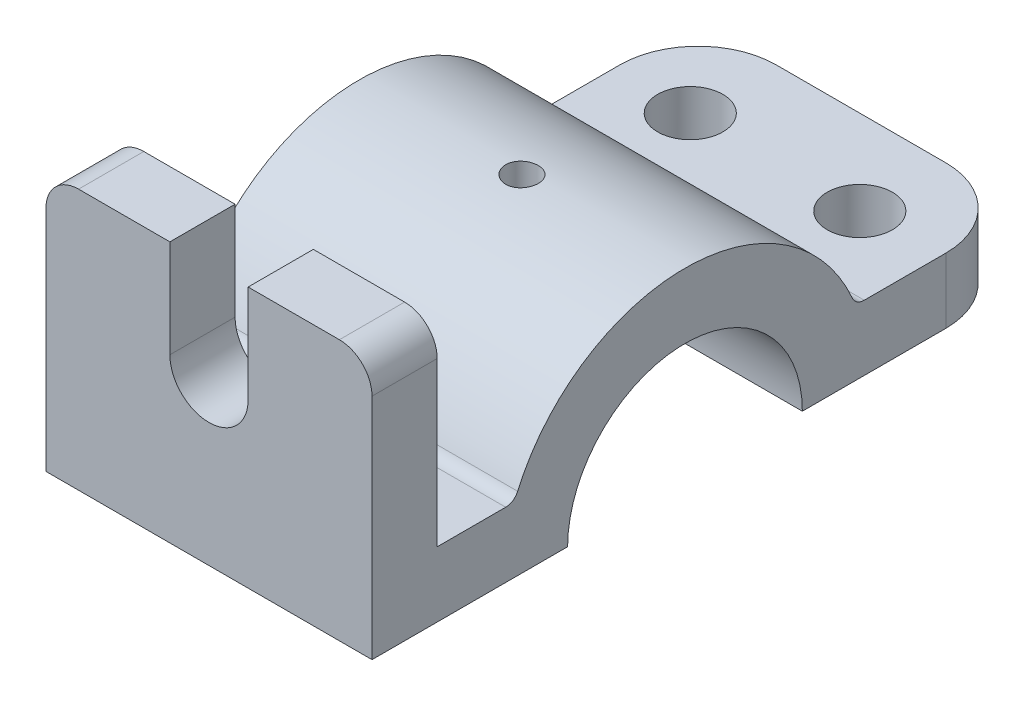
ISO-10303-21;
HEADER;
FILE_DESCRIPTION(('STEP AP214'),'2;1');
FILE_NAME('part.step','',(''),(''),'','','');
FILE_SCHEMA(('AUTOMOTIVE_DESIGN { 1 0 10303 214 1 1 1 1 }'));
ENDSEC;
DATA;
#1=APPLICATION_CONTEXT('core data for automotive mechanical design processes');
#2=APPLICATION_PROTOCOL_DEFINITION('international standard','automotive_design',2000,#1);
#3=PRODUCT_CONTEXT('',#1,'mechanical');
#4=PRODUCT('Part','Part','',(#3));
#5=PRODUCT_RELATED_PRODUCT_CATEGORY('part','',(#4));
#6=PRODUCT_DEFINITION_FORMATION('','',#4);
#7=PRODUCT_DEFINITION_CONTEXT('part definition',#1,'design');
#8=PRODUCT_DEFINITION('design','',#6,#7);
#9=PRODUCT_DEFINITION_SHAPE('','',#8);
#10=(LENGTH_UNIT() NAMED_UNIT(*) SI_UNIT(.MILLI.,.METRE.));
#11=(NAMED_UNIT(*) PLANE_ANGLE_UNIT() SI_UNIT($,.RADIAN.));
#12=(NAMED_UNIT(*) SI_UNIT($,.STERADIAN.) SOLID_ANGLE_UNIT());
#13=UNCERTAINTY_MEASURE_WITH_UNIT(LENGTH_MEASURE(1.E-05),#10,'distance_accuracy_value','');
#14=(GEOMETRIC_REPRESENTATION_CONTEXT(3) GLOBAL_UNCERTAINTY_ASSIGNED_CONTEXT((#13)) GLOBAL_UNIT_ASSIGNED_CONTEXT((#10,
#11,#12)) REPRESENTATION_CONTEXT('',''));
#15=CARTESIAN_POINT('',(0.,0.,0.));
#16=DIRECTION('',(0.,0.,1.));
#17=DIRECTION('',(1.,0.,0.));
#18=AXIS2_PLACEMENT_3D('',#15,#16,#17);
#19=CARTESIAN_POINT('',(-50.,40.,48.));
#20=DIRECTION('',(0.,1.,0.));
#21=DIRECTION('',(0.,0.,1.));
#22=AXIS2_PLACEMENT_3D('',#19,#20,#21);
#23=PLANE('',#22);
#24=DIRECTION('',(0.,0.,1.));
#25=VECTOR('',#24,1.);
#26=CARTESIAN_POINT('',(-31.,40.,13.8132267551043));
#27=LINE('',#26,#25);
#28=CARTESIAN_POINT('',(-31.,40.,38.));
#29=VERTEX_POINT('',#28);
#30=CARTESIAN_POINT('',(-31.,40.,48.));
#31=VERTEX_POINT('',#30);
#32=EDGE_CURVE('E222',#29,#31,#27,.T.);
#33=ORIENTED_EDGE('',*,*,#32,.F.);
#34=DIRECTION('',(1.,0.,0.));
#35=VECTOR('',#34,1.);
#36=CARTESIAN_POINT('',(-50.,40.,38.));
#37=LINE('',#36,#35);
#38=CARTESIAN_POINT('',(-45.,40.,38.));
#39=VERTEX_POINT('',#38);
#40=EDGE_CURVE('E205',#39,#29,#37,.T.);
#41=ORIENTED_EDGE('',*,*,#40,.F.);
#42=DIRECTION('',(0.,0.,1.));
#43=VECTOR('',#42,1.);
#44=CARTESIAN_POINT('',(-45.,40.,48.));
#45=LINE('',#44,#43);
#46=CARTESIAN_POINT('',(-45.,40.,48.));
#47=VERTEX_POINT('',#46);
#48=EDGE_CURVE('E321',#39,#47,#45,.T.);
#49=ORIENTED_EDGE('',*,*,#48,.T.);
#50=DIRECTION('',(1.,0.,0.));
#51=VECTOR('',#50,1.);
#52=CARTESIAN_POINT('',(-50.,40.,48.));
#53=LINE('',#52,#51);
#54=EDGE_CURVE('E295',#47,#31,#53,.T.);
#55=ORIENTED_EDGE('',*,*,#54,.T.);
#56=EDGE_LOOP('',(#33,#41,#49,#55));
#57=FACE_BOUND('',#56,.T.);
#58=ADVANCED_FACE('F45',(#57),#23,.T.);
#59=CARTESIAN_POINT('',(-50.,0.,0.));
#60=DIRECTION('',(1.,0.,0.));
#61=DIRECTION('',(0.,0.,-1.));
#62=AXIS2_PLACEMENT_3D('',#59,#60,#61);
#63=CYLINDRICAL_SURFACE('',#62,18.);
#64=CARTESIAN_POINT('',(-25.,17.8255434699759,2.5));
#65=CARTESIAN_POINT('',(-24.8603024398441,17.8255456651778,2.49999414647207));
#66=CARTESIAN_POINT('',(-24.720520879389,17.8272034218136,2.48825119822493));
#67=CARTESIAN_POINT('',(-24.4448574895751,17.8336517721437,2.44159735847892));
#68=CARTESIAN_POINT('',(-24.3089797346522,17.8384455231609,2.4066631174329));
#69=CARTESIAN_POINT('',(-24.0451544790156,17.850612662598,2.31468476561208));
#70=CARTESIAN_POINT('',(-23.917201299054,17.8579841778482,2.25765670639229));
#71=CARTESIAN_POINT('',(-23.6727013407084,17.8744740260859,2.12314581292503));
#72=CARTESIAN_POINT('',(-23.5561528193297,17.883592091513,2.04566611105294));
#73=CARTESIAN_POINT('',(-23.3369479132659,17.9026178552788,1.87188129283679));
#74=CARTESIAN_POINT('',(-23.2343813714768,17.9125300649078,1.77546333288681));
#75=CARTESIAN_POINT('',(-23.0468293366808,17.9319868631884,1.56678234973466));
#76=CARTESIAN_POINT('',(-22.9618447665517,17.941531432521,1.45451849530127));
#77=CARTESIAN_POINT('',(-22.8115415716044,17.9592243086621,1.21676158545023));
#78=CARTESIAN_POINT('',(-22.7463050644584,17.9673667260989,1.09121614197955));
#79=CARTESIAN_POINT('',(-22.6378763141992,17.9812880686337,0.830818835610925));
#80=CARTESIAN_POINT('',(-22.5946830686033,17.9870671012112,0.695967396247416));
#81=CARTESIAN_POINT('',(-22.5318375950693,17.9955787286343,0.421708758837697));
#82=CARTESIAN_POINT('',(-22.5120353483376,17.9983307295005,0.282336549066869));
#83=CARTESIAN_POINT('',(-22.4960685804611,18.0005446194064,0.00222208197153337));
#84=CARTESIAN_POINT('',(-22.4999029241978,18.0000066664419,-0.138520109237201));
#85=CARTESIAN_POINT('',(-22.5309812504974,17.9957168570418,-0.416357194248957));
#86=CARTESIAN_POINT('',(-22.5580638636251,17.9919871555225,-0.553470528957734));
#87=CARTESIAN_POINT('',(-22.6346171415796,17.9817576581678,-0.821187276586971));
#88=CARTESIAN_POINT('',(-22.6840883141918,17.9752577995039,-0.951790541780741));
#89=CARTESIAN_POINT('',(-22.8041825811449,17.9601801355727,-1.20327342479254));
#90=CARTESIAN_POINT('',(-22.8748744928555,17.9515955873736,-1.32411975854592));
#91=CARTESIAN_POINT('',(-23.0353534008281,17.933307030451,-1.55229539206434));
#92=CARTESIAN_POINT('',(-23.1251414767556,17.9236029584457,-1.6596239270089));
#93=CARTESIAN_POINT('',(-23.3221652052143,17.9040627416807,-1.85866707142927));
#94=CARTESIAN_POINT('',(-23.4295416350916,17.8942261733153,-1.95024234614373));
#95=CARTESIAN_POINT('',(-23.658213295894,17.8756098810753,-2.11409384295317));
#96=CARTESIAN_POINT('',(-23.7795085910069,17.8668301620749,-2.18636997604351));
#97=CARTESIAN_POINT('',(-24.0327102271101,17.8513218970602,-2.30958526232834));
#98=CARTESIAN_POINT('',(-24.1646228984433,17.8445945863646,-2.36051157220434));
#99=CARTESIAN_POINT('',(-24.4352426550245,17.8339756835222,-2.43944921221491));
#100=CARTESIAN_POINT('',(-24.573949332164,17.8300839212696,-2.46746191695965));
#101=CARTESIAN_POINT('',(-24.8529842890421,17.8256085226883,-2.49958914868686));
#102=CARTESIAN_POINT('',(-24.9932894831189,17.8249976384891,-2.50390052359804));
#103=CARTESIAN_POINT('',(-25.2726202693447,17.8270809550551,-2.48902367005747));
#104=CARTESIAN_POINT('',(-25.4116458952648,17.8297750683396,-2.46983606360645));
#105=CARTESIAN_POINT('',(-25.6838706006518,17.8381398718555,-2.40867230893183));
#106=CARTESIAN_POINT('',(-25.8170918480129,17.8437979170435,-2.3667929448424));
#107=CARTESIAN_POINT('',(-26.0746226062418,17.8574427280592,-2.26153466064822));
#108=CARTESIAN_POINT('',(-26.1989317351835,17.8654295936137,-2.19815481981357));
#109=CARTESIAN_POINT('',(-26.4359958172227,17.8828968337135,-2.05121661698077));
#110=CARTESIAN_POINT('',(-26.5486706068941,17.8923865584876,-1.96753005280694));
#111=CARTESIAN_POINT('',(-26.7584463845479,17.9117615643821,-1.7825335739982));
#112=CARTESIAN_POINT('',(-26.8555466205301,17.9216468645736,-1.68122280889013));
#113=CARTESIAN_POINT('',(-27.0321167080711,17.9407836925958,-1.46299009780057));
#114=CARTESIAN_POINT('',(-27.1114566166581,17.95003022752,-1.34596251463768));
#115=CARTESIAN_POINT('',(-27.2493514621579,17.9667715107689,-1.10012679276879));
#116=CARTESIAN_POINT('',(-27.3079068998178,17.9742663012958,-0.971318937971421));
#117=CARTESIAN_POINT('',(-27.402359747304,17.9866376355466,-0.705996872679641));
#118=CARTESIAN_POINT('',(-27.4383300854722,17.9915225988255,-0.56950903318716));
#119=CARTESIAN_POINT('',(-27.4868282942683,17.9981590483869,-0.292358088096121));
#120=CARTESIAN_POINT('',(-27.4993574832228,17.9999107108855,-0.15169521775266));
#121=CARTESIAN_POINT('',(-27.5005890779198,18.0000818666563,0.128548687836635));
#122=CARTESIAN_POINT('',(-27.4894910144668,17.9985292642962,0.2681288706641));
#123=CARTESIAN_POINT('',(-27.4442084499849,17.9923222178002,0.543418783188119));
#124=CARTESIAN_POINT('',(-27.410023993736,17.9876677796809,0.679128520391503));
#125=CARTESIAN_POINT('',(-27.3196060948268,17.9757775608188,0.942783693400789));
#126=CARTESIAN_POINT('',(-27.2633845055166,17.9685431679724,1.0707332606013));
#127=CARTESIAN_POINT('',(-27.1305091613232,17.9522906414495,1.31541393615633));
#128=CARTESIAN_POINT('',(-27.0538549362355,17.9432724667251,1.43214478625686));
#129=CARTESIAN_POINT('',(-26.881560649973,17.924366090709,1.65209019579665));
#130=CARTESIAN_POINT('',(-26.7857726570414,17.9144714675246,1.75518832986405));
#131=CARTESIAN_POINT('',(-26.5782402651736,17.8949767682912,1.94392197658014));
#132=CARTESIAN_POINT('',(-26.4664921138235,17.8853767621566,2.02955337107177));
#133=CARTESIAN_POINT('',(-26.2295894082365,17.8675092105597,2.1812832362249));
#134=CARTESIAN_POINT('',(-26.1043733368759,17.8592482521941,2.2472864031197));
#135=CARTESIAN_POINT('',(-25.8445828211181,17.8450712340564,2.35722985388596));
#136=CARTESIAN_POINT('',(-25.710018480695,17.8391526874774,2.40119354912318));
#137=CARTESIAN_POINT('',(-25.4790043902769,17.8317307423883,2.45557541109681));
#138=CARTESIAN_POINT('',(-25.3839964229692,17.8294224644947,2.47220986746721));
#139=CARTESIAN_POINT('',(-25.192672282592,17.8263280790367,2.49442412388262));
#140=CARTESIAN_POINT('',(-25.0963561229681,17.8255419558396,2.50000403745962));
#141=CARTESIAN_POINT('',(-25.,17.8255434699759,2.5));
#142=B_SPLINE_CURVE_WITH_KNOTS('',3,(#64,#65,#66,#67,#68,#69,#70,#71,#72,#73,#74,#75,#76,#77,
#78,#79,#80,#81,#82,#83,#84,#85,#86,#87,#88,#89,#90,#91,#92,#93,#94,#95,#96,#97,#98,#99,#100,
#101,#102,#103,#104,#105,#106,#107,#108,#109,#110,#111,#112,#113,#114,#115,#116,#117,#118,#119,
#120,#121,#122,#123,#124,#125,#126,#127,#128,#129,#130,#131,#132,#133,#134,#135,#136,#137,#138,
#139,#140,#141),.UNSPECIFIED.,.T.,.F.,(4,2,2,2,2,2,2,2,2,2,2,2,2,2,2,2,2,2,2,2,2,2,2,2,2,2,2,2,
2,2,2,2,2,2,2,2,2,2,4),(0.,0.418740578666761,0.837903396050356,1.25676225348656,
1.67555699564973,2.09692727352601,2.51831966352644,2.94144097718361,3.36454304643011,
3.78491654588533,4.20526985757441,4.62272881613957,5.04019724338734,5.45903439175162,
5.87789522677331,6.3002890317342,6.72268478467589,7.14533427300389,7.56795840430469,
7.98706712895252,8.40616476034102,8.82348878189816,9.24083067706897,9.66087924830117,
10.0809480950163,10.5039966111509,10.9270349343551,11.3487001254109,11.7703416013695,
12.1884364704187,12.606530528507,13.0244000097613,13.4422791080349,13.8635236199147,
14.2848673346814,14.7082246552416,15.1311313077059,15.4199597814033,15.7087852887688),.UNSPECIFIED.);
#143=CARTESIAN_POINT('',(-25.,17.8255434699759,2.5));
#144=VERTEX_POINT('',#143);
#145=EDGE_CURVE('E374',#144,#144,#142,.T.);
#146=ORIENTED_EDGE('',*,*,#145,.T.);
#147=EDGE_LOOP('',(#146));
#148=FACE_BOUND('',#147,.T.);
#149=CARTESIAN_POINT('',(0.,0.,0.));
#150=DIRECTION('',(-1.,0.,0.));
#151=DIRECTION('',(0.,0.,-1.));
#152=AXIS2_PLACEMENT_3D('',#149,#150,#151);
#153=CIRCLE('',#152,18.);
#154=CARTESIAN_POINT('',(0.,0.,18.));
#155=VERTEX_POINT('',#154);
#156=CARTESIAN_POINT('',(0.,0.,-18.));
#157=VERTEX_POINT('',#156);
#158=EDGE_CURVE('E227',#155,#157,#153,.T.);
#159=ORIENTED_EDGE('',*,*,#158,.F.);
#160=DIRECTION('',(1.,0.,0.));
#161=VECTOR('',#160,1.);
#162=CARTESIAN_POINT('',(-50.,0.,18.));
#163=LINE('',#162,#161);
#164=CARTESIAN_POINT('',(-50.,0.,18.));
#165=VERTEX_POINT('',#164);
#166=EDGE_CURVE('E287',#165,#155,#163,.T.);
#167=ORIENTED_EDGE('',*,*,#166,.F.);
#168=CARTESIAN_POINT('',(-50.,0.,0.));
#169=DIRECTION('',(-1.,0.,0.));
#170=DIRECTION('',(0.,0.,-1.));
#171=AXIS2_PLACEMENT_3D('',#168,#169,#170);
#172=CIRCLE('',#171,18.);
#173=CARTESIAN_POINT('',(-50.,0.,-18.));
#174=VERTEX_POINT('',#173);
#175=EDGE_CURVE('E228',#165,#174,#172,.T.);
#176=ORIENTED_EDGE('',*,*,#175,.T.);
#177=DIRECTION('',(1.,0.,0.));
#178=VECTOR('',#177,1.);
#179=CARTESIAN_POINT('',(-50.,0.,-18.));
#180=LINE('',#179,#178);
#181=EDGE_CURVE('E259',#174,#157,#180,.T.);
#182=ORIENTED_EDGE('',*,*,#181,.T.);
#183=EDGE_LOOP('',(#159,#167,#176,#182));
#184=FACE_BOUND('',#183,.T.);
#185=ADVANCED_FACE('F454',(#148,#184),#63,.F.);
#186=CARTESIAN_POINT('',(-50.,0.,18.));
#187=DIRECTION('',(0.,-1.,0.));
#188=DIRECTION('',(0.,0.,-1.));
#189=AXIS2_PLACEMENT_3D('',#186,#187,#188);
#190=PLANE('',#189);
#191=DIRECTION('',(0.,0.,-1.));
#192=VECTOR('',#191,1.);
#193=CARTESIAN_POINT('',(0.,0.,18.));
#194=LINE('',#193,#192);
#195=CARTESIAN_POINT('',(0.,0.,48.));
#196=VERTEX_POINT('',#195);
#197=EDGE_CURVE('E233',#196,#155,#194,.T.);
#198=ORIENTED_EDGE('',*,*,#197,.F.);
#199=DIRECTION('',(1.,0.,0.));
#200=VECTOR('',#199,1.);
#201=CARTESIAN_POINT('',(-50.,0.,48.));
#202=LINE('',#201,#200);
#203=CARTESIAN_POINT('',(-50.,0.,48.));
#204=VERTEX_POINT('',#203);
#205=EDGE_CURVE('E291',#204,#196,#202,.T.);
#206=ORIENTED_EDGE('',*,*,#205,.F.);
#207=DIRECTION('',(0.,0.,-1.));
#208=VECTOR('',#207,1.);
#209=CARTESIAN_POINT('',(-50.,0.,18.));
#210=LINE('',#209,#208);
#211=EDGE_CURVE('E255',#204,#165,#210,.T.);
#212=ORIENTED_EDGE('',*,*,#211,.T.);
#213=ORIENTED_EDGE('',*,*,#166,.T.);
#214=EDGE_LOOP('',(#198,#206,#212,#213));
#215=FACE_BOUND('',#214,.T.);
#216=ADVANCED_FACE('F463',(#215),#190,.T.);
#217=CARTESIAN_POINT('',(-50.,0.,48.));
#218=DIRECTION('',(0.,0.,1.));
#219=DIRECTION('',(1.,0.,0.));
#220=AXIS2_PLACEMENT_3D('',#217,#218,#219);
#221=PLANE('',#220);
#222=DIRECTION('',(0.,-1.,0.));
#223=VECTOR('',#222,1.);
#224=CARTESIAN_POINT('',(-31.,40.,48.));
#225=LINE('',#224,#223);
#226=CARTESIAN_POINT('',(-31.,25.,48.));
#227=VERTEX_POINT('',#226);
#228=EDGE_CURVE('E198',#31,#227,#225,.T.);
#229=ORIENTED_EDGE('',*,*,#228,.F.);
#230=ORIENTED_EDGE('',*,*,#54,.F.);
#231=CARTESIAN_POINT('',(-45.,35.,48.));
#232=DIRECTION('',(0.,0.,1.));
#233=DIRECTION('',(1.,0.,0.));
#234=AXIS2_PLACEMENT_3D('',#231,#232,#233);
#235=CIRCLE('',#234,5.);
#236=CARTESIAN_POINT('',(-50.,35.,48.));
#237=VERTEX_POINT('',#236);
#238=EDGE_CURVE('E329',#47,#237,#235,.T.);
#239=ORIENTED_EDGE('',*,*,#238,.T.);
#240=DIRECTION('',(0.,-1.,0.));
#241=VECTOR('',#240,1.);
#242=CARTESIAN_POINT('',(-50.,0.,48.));
#243=LINE('',#242,#241);
#244=EDGE_CURVE('E252',#237,#204,#243,.T.);
#245=ORIENTED_EDGE('',*,*,#244,.T.);
#246=ORIENTED_EDGE('',*,*,#205,.T.);
#247=DIRECTION('',(0.,-1.,0.));
#248=VECTOR('',#247,1.);
#249=CARTESIAN_POINT('',(0.,0.,48.));
#250=LINE('',#249,#248);
#251=CARTESIAN_POINT('',(0.,35.,48.));
#252=VERTEX_POINT('',#251);
#253=EDGE_CURVE('E281',#252,#196,#250,.T.);
#254=ORIENTED_EDGE('',*,*,#253,.F.);
#255=CARTESIAN_POINT('',(-5.,35.,48.));
#256=DIRECTION('',(0.,0.,1.));
#257=DIRECTION('',(1.,0.,0.));
#258=AXIS2_PLACEMENT_3D('',#255,#256,#257);
#259=CIRCLE('',#258,5.);
#260=CARTESIAN_POINT('',(-5.,40.,48.));
#261=VERTEX_POINT('',#260);
#262=EDGE_CURVE('E325',#252,#261,#259,.T.);
#263=ORIENTED_EDGE('',*,*,#262,.T.);
#264=CARTESIAN_POINT('',(-19.,40.,48.));
#265=VERTEX_POINT('',#264);
#266=EDGE_CURVE('E299',#265,#261,#53,.T.);
#267=ORIENTED_EDGE('',*,*,#266,.F.);
#268=DIRECTION('',(0.,1.,0.));
#269=VECTOR('',#268,1.);
#270=CARTESIAN_POINT('',(-19.,25.,48.));
#271=LINE('',#270,#269);
#272=CARTESIAN_POINT('',(-19.,25.,48.));
#273=VERTEX_POINT('',#272);
#274=EDGE_CURVE('E207',#273,#265,#271,.T.);
#275=ORIENTED_EDGE('',*,*,#274,.F.);
#276=CARTESIAN_POINT('',(-25.,25.,48.));
#277=DIRECTION('',(0.,0.,1.));
#278=DIRECTION('',(1.,0.,0.));
#279=AXIS2_PLACEMENT_3D('',#276,#277,#278);
#280=CIRCLE('',#279,6.);
#281=EDGE_CURVE('E210',#227,#273,#280,.T.);
#282=ORIENTED_EDGE('',*,*,#281,.F.);
#283=EDGE_LOOP('',(#229,#230,#239,#245,#246,#254,#263,#267,#275,#282));
#284=FACE_BOUND('',#283,.T.);
#285=ADVANCED_FACE('F469',(#284),#221,.T.);
#286=DIRECTION('',(0.,0.,1.));
#287=VECTOR('',#286,1.);
#288=CARTESIAN_POINT('',(-19.,40.,13.8132267551043));
#289=LINE('',#288,#287);
#290=CARTESIAN_POINT('',(-19.,40.,38.));
#291=VERTEX_POINT('',#290);
#292=EDGE_CURVE('E217',#291,#265,#289,.T.);
#293=ORIENTED_EDGE('',*,*,#292,.T.);
#294=ORIENTED_EDGE('',*,*,#266,.T.);
#295=DIRECTION('',(0.,0.,1.));
#296=VECTOR('',#295,1.);
#297=CARTESIAN_POINT('',(-5.,40.,48.));
#298=LINE('',#297,#296);
#299=CARTESIAN_POINT('',(-5.,40.,38.));
#300=VERTEX_POINT('',#299);
#301=EDGE_CURVE('E290',#261,#300,#298,.F.);
#302=ORIENTED_EDGE('',*,*,#301,.T.);
#303=EDGE_CURVE('E302',#291,#300,#37,.T.);
#304=ORIENTED_EDGE('',*,*,#303,.F.);
#305=EDGE_LOOP('',(#293,#294,#302,#304));
#306=FACE_BOUND('',#305,.T.);
#307=ADVANCED_FACE('F457',(#306),#23,.T.);
#308=CARTESIAN_POINT('',(-50.,40.,38.));
#309=DIRECTION('',(0.,0.,-1.));
#310=DIRECTION('',(0.,1.,0.));
#311=AXIS2_PLACEMENT_3D('',#308,#309,#310);
#312=PLANE('',#311);
#313=DIRECTION('',(0.,-1.,0.));
#314=VECTOR('',#313,1.);
#315=CARTESIAN_POINT('',(-31.,40.,38.));
#316=LINE('',#315,#314);
#317=CARTESIAN_POINT('',(-31.,25.,38.));
#318=VERTEX_POINT('',#317);
#319=EDGE_CURVE('E195',#29,#318,#316,.T.);
#320=ORIENTED_EDGE('',*,*,#319,.T.);
#321=CARTESIAN_POINT('',(-25.,25.,38.));
#322=DIRECTION('',(0.,0.,-1.));
#323=DIRECTION('',(0.,1.,0.));
#324=AXIS2_PLACEMENT_3D('',#321,#322,#323);
#325=CIRCLE('',#324,6.);
#326=CARTESIAN_POINT('',(-19.,25.,38.));
#327=VERTEX_POINT('',#326);
#328=EDGE_CURVE('E181',#318,#327,#325,.F.);
#329=ORIENTED_EDGE('',*,*,#328,.T.);
#330=DIRECTION('',(0.,1.,0.));
#331=VECTOR('',#330,1.);
#332=CARTESIAN_POINT('',(-19.,25.,38.));
#333=LINE('',#332,#331);
#334=EDGE_CURVE('E215',#327,#291,#333,.T.);
#335=ORIENTED_EDGE('',*,*,#334,.T.);
#336=ORIENTED_EDGE('',*,*,#303,.T.);
#337=CARTESIAN_POINT('',(-5.,35.,38.));
#338=DIRECTION('',(0.,0.,-1.));
#339=DIRECTION('',(0.,1.,0.));
#340=AXIS2_PLACEMENT_3D('',#337,#338,#339);
#341=CIRCLE('',#340,5.);
#342=CARTESIAN_POINT('',(0.,35.,38.));
#343=VERTEX_POINT('',#342);
#344=EDGE_CURVE('E335',#300,#343,#341,.T.);
#345=ORIENTED_EDGE('',*,*,#344,.T.);
#346=DIRECTION('',(0.,1.,0.));
#347=VECTOR('',#346,1.);
#348=CARTESIAN_POINT('',(0.,40.,38.));
#349=LINE('',#348,#347);
#350=CARTESIAN_POINT('',(0.,9.99999999999999,38.));
#351=VERTEX_POINT('',#350);
#352=EDGE_CURVE('E277',#351,#343,#349,.T.);
#353=ORIENTED_EDGE('',*,*,#352,.F.);
#354=DIRECTION('',(1.,0.,0.));
#355=VECTOR('',#354,1.);
#356=CARTESIAN_POINT('',(-50.,9.99999999999999,38.));
#357=LINE('',#356,#355);
#358=CARTESIAN_POINT('',(-50.,9.99999999999999,38.));
#359=VERTEX_POINT('',#358);
#360=EDGE_CURVE('E303',#359,#351,#357,.T.);
#361=ORIENTED_EDGE('',*,*,#360,.F.);
#362=DIRECTION('',(0.,1.,0.));
#363=VECTOR('',#362,1.);
#364=CARTESIAN_POINT('',(-50.,40.,38.));
#365=LINE('',#364,#363);
#366=CARTESIAN_POINT('',(-50.,35.,38.));
#367=VERTEX_POINT('',#366);
#368=EDGE_CURVE('E248',#359,#367,#365,.T.);
#369=ORIENTED_EDGE('',*,*,#368,.T.);
#370=CARTESIAN_POINT('',(-45.,35.,38.));
#371=DIRECTION('',(0.,0.,-1.));
#372=DIRECTION('',(0.,1.,0.));
#373=AXIS2_PLACEMENT_3D('',#370,#371,#372);
#374=CIRCLE('',#373,5.);
#375=EDGE_CURVE('E338',#367,#39,#374,.T.);
#376=ORIENTED_EDGE('',*,*,#375,.T.);
#377=ORIENTED_EDGE('',*,*,#40,.T.);
#378=EDGE_LOOP('',(#320,#329,#335,#336,#345,#353,#361,#369,#376,#377));
#379=FACE_BOUND('',#378,.T.);
#380=ADVANCED_FACE('F203',(#379),#312,.T.);
#381=CARTESIAN_POINT('',(-50.,9.99999999999999,38.));
#382=DIRECTION('',(0.,1.,0.));
#383=DIRECTION('',(0.,0.,1.));
#384=AXIS2_PLACEMENT_3D('',#381,#382,#383);
#385=PLANE('',#384);
#386=DIRECTION('',(0.,0.,1.));
#387=VECTOR('',#386,1.);
#388=CARTESIAN_POINT('',(0.,9.99999999999999,38.));
#389=LINE('',#388,#387);
#390=CARTESIAN_POINT('',(0.,9.99999999999998,27.495454169735));
#391=VERTEX_POINT('',#390);
#392=EDGE_CURVE('E274',#391,#351,#389,.T.);
#393=ORIENTED_EDGE('',*,*,#392,.F.);
#394=DIRECTION('',(-1.,0.,0.));
#395=VECTOR('',#394,1.);
#396=CARTESIAN_POINT('',(-50.,9.99999999999998,27.495454169735));
#397=LINE('',#396,#395);
#398=CARTESIAN_POINT('',(-50.,9.99999999999998,27.495454169735));
#399=VERTEX_POINT('',#398);
#400=EDGE_CURVE('E61',#391,#399,#397,.T.);
#401=ORIENTED_EDGE('',*,*,#400,.T.);
#402=DIRECTION('',(0.,0.,1.));
#403=VECTOR('',#402,1.);
#404=CARTESIAN_POINT('',(-50.,9.99999999999999,38.));
#405=LINE('',#404,#403);
#406=EDGE_CURVE('E245',#399,#359,#405,.T.);
#407=ORIENTED_EDGE('',*,*,#406,.T.);
#408=ORIENTED_EDGE('',*,*,#360,.T.);
#409=EDGE_LOOP('',(#393,#401,#407,#408));
#410=FACE_BOUND('',#409,.T.);
#411=ADVANCED_FACE('F474',(#410),#385,.T.);
#412=CARTESIAN_POINT('',(-50.,0.,0.));
#413=DIRECTION('',(1.,0.,0.));
#414=DIRECTION('',(0.,0.,-1.));
#415=AXIS2_PLACEMENT_3D('',#412,#413,#414);
#416=CYLINDRICAL_SURFACE('',#415,28.);
#417=CARTESIAN_POINT('',(-25.,27.8881695347687,2.5));
#418=CARTESIAN_POINT('',(-24.8598745098774,27.8881710111309,2.49999389531037));
#419=CARTESIAN_POINT('',(-24.7196545466619,27.8892370097261,2.48817925923313));
#420=CARTESIAN_POINT('',(-24.4430969927657,27.8933855985423,2.44122385739468));
#421=CARTESIAN_POINT('',(-24.3067639400155,27.8964704526227,2.40605690467988));
#422=CARTESIAN_POINT('',(-24.0420255510757,27.9043045970426,2.31342440908677));
#423=CARTESIAN_POINT('',(-23.9136156656606,27.9090529216127,2.25597180263069));
#424=CARTESIAN_POINT('',(-23.6682915406191,27.9196777891206,2.12042251692447));
#425=CARTESIAN_POINT('',(-23.5513749091377,27.9255540965596,2.04233014553593));
#426=CARTESIAN_POINT('',(-23.331984327154,27.9377921105712,1.86747170064062));
#427=CARTESIAN_POINT('',(-23.2295486893212,27.9441550385916,1.77065763819643));
#428=CARTESIAN_POINT('',(-23.0423572912707,27.9566382029413,1.56120595182853));
#429=CARTESIAN_POINT('',(-22.9576023156137,27.9627584284912,1.44856762609076));
#430=CARTESIAN_POINT('',(-22.8080487173174,27.9740783706155,1.21043385509877));
#431=CARTESIAN_POINT('',(-22.743283542974,27.9792765382263,1.08491732362872));
#432=CARTESIAN_POINT('',(-22.6357619461737,27.9881534599075,0.824736940543531));
#433=CARTESIAN_POINT('',(-22.5930050877127,27.9918322440781,0.690073270201077));
#434=CARTESIAN_POINT('',(-22.5308249381216,27.9972473488409,0.41580489951493));
#435=CARTESIAN_POINT('',(-22.5113392807773,27.9989888604098,0.276214442499725));
#436=CARTESIAN_POINT('',(-22.4960618044134,28.0003508135933,-0.00426577845412908));
#437=CARTESIAN_POINT('',(-22.500269486276,27.9999712998888,-0.14515551496007));
#438=CARTESIAN_POINT('',(-22.5322083722396,27.9971382343476,-0.423811909098482));
#439=CARTESIAN_POINT('',(-22.5598725124099,27.9946905955189,-0.561586321918481));
#440=CARTESIAN_POINT('',(-22.637834686198,27.9880033031574,-0.830528561886642));
#441=CARTESIAN_POINT('',(-22.6881329619905,27.9837636304507,-0.961696318329991));
#442=CARTESIAN_POINT('',(-22.8100099599861,27.9739589571816,-1.21391460484907));
#443=CARTESIAN_POINT('',(-22.8816185965935,27.9683920957784,-1.33495060440947));
#444=CARTESIAN_POINT('',(-23.0440618904019,27.956558324439,-1.56331103077738));
#445=CARTESIAN_POINT('',(-23.1348969961461,27.9502913981723,-1.6706351376001));
#446=CARTESIAN_POINT('',(-23.3335924590778,27.9377356449561,-1.86891758938319));
#447=CARTESIAN_POINT('',(-23.4415111126823,27.9314468178845,-1.95981752662282));
#448=CARTESIAN_POINT('',(-23.6711074471145,27.9195779856024,-2.12221976115038));
#449=CARTESIAN_POINT('',(-23.7927851418747,27.9139979811096,-2.19372203879585));
#450=CARTESIAN_POINT('',(-24.0464878895535,27.9041777418417,-2.31529769586279));
#451=CARTESIAN_POINT('',(-24.1785144962296,27.8999377087288,-2.36536785020494));
#452=CARTESIAN_POINT('',(-24.4491468737917,27.8932815329154,-2.44261371015086));
#453=CARTESIAN_POINT('',(-24.5877524854813,27.8908653461059,-2.46978996943485));
#454=CARTESIAN_POINT('',(-24.8670967156666,27.8881377745177,-2.50040226425456));
#455=CARTESIAN_POINT('',(-25.0078263310335,27.8878191606471,-2.50391983817703));
#456=CARTESIAN_POINT('',(-25.2878731481961,27.8893037323215,-2.48732868478699));
#457=CARTESIAN_POINT('',(-25.4271903651313,27.8911068950989,-2.46722021099227));
#458=CARTESIAN_POINT('',(-25.7002223918464,27.8966252645227,-2.40401582588965));
#459=CARTESIAN_POINT('',(-25.8339461191501,27.9003372916738,-2.3609581355548));
#460=CARTESIAN_POINT('',(-26.0922717986784,27.9092525248752,-2.25311647730858));
#461=CARTESIAN_POINT('',(-26.216873583284,27.9144557583184,-2.1883321102839));
#462=CARTESIAN_POINT('',(-26.4537910219124,27.9257846531798,-2.03867045795276));
#463=CARTESIAN_POINT('',(-26.5660722963978,27.9319127878244,-1.95373893920362));
#464=CARTESIAN_POINT('',(-26.7748136020378,27.9443927324922,-1.7662720034769));
#465=CARTESIAN_POINT('',(-26.8712733208569,27.950744546928,-1.66373623905318));
#466=CARTESIAN_POINT('',(-27.045912661215,27.9629777922917,-1.44361860685839));
#467=CARTESIAN_POINT('',(-27.1240392326942,27.9688578265061,-1.32599456130557));
#468=CARTESIAN_POINT('',(-27.2594302017397,27.9794647961578,-1.07924881877036));
#469=CARTESIAN_POINT('',(-27.3166948341256,27.9841917445738,-0.950127251223026));
#470=CARTESIAN_POINT('',(-27.4086456945092,27.9919535599103,-0.684240189403228));
#471=CARTESIAN_POINT('',(-27.4433644702158,27.994990865125,-0.547486025053392));
#472=CARTESIAN_POINT('',(-27.4893444051411,27.9990411101695,-0.270061007856406));
#473=CARTESIAN_POINT('',(-27.5006060806642,28.0000540945556,-0.129390241285008));
#474=CARTESIAN_POINT('',(-27.4993457082183,27.999941600834,0.151352564175455));
#475=CARTESIAN_POINT('',(-27.4869062268484,27.99882354652,0.291424984089435));
#476=CARTESIAN_POINT('',(-27.4387691543383,27.994589262146,0.567482484252252));
#477=CARTESIAN_POINT('',(-27.403071535655,27.9914730297197,0.703467559660504));
#478=CARTESIAN_POINT('',(-27.3094531598737,27.9835918563844,0.967493539242319));
#479=CARTESIAN_POINT('',(-27.2515342123309,27.9788270497272,1.095535089297));
#480=CARTESIAN_POINT('',(-27.1151264626607,27.9681811406978,1.34009102106455));
#481=CARTESIAN_POINT('',(-27.0366379163967,27.9623000522111,1.45660554613621));
#482=CARTESIAN_POINT('',(-26.8610089017278,27.9500568179517,1.67522291395882));
#483=CARTESIAN_POINT('',(-26.7638071526806,27.9436931344959,1.77727644020076));
#484=CARTESIAN_POINT('',(-26.5536259843672,27.9312150321662,1.96366426782912));
#485=CARTESIAN_POINT('',(-26.4406427619918,27.9251006738364,2.04799428579795));
#486=CARTESIAN_POINT('',(-26.2018550208149,27.9137996960197,2.19667361486831));
#487=CARTESIAN_POINT('',(-26.0760241347782,27.9086150471752,2.26098069213662));
#488=CARTESIAN_POINT('',(-25.8153883155801,27.8997843303743,2.36747034650808));
#489=CARTESIAN_POINT('',(-25.6805938338602,27.8961365056955,2.40967819840705));
#490=CARTESIAN_POINT('',(-25.4541788673974,27.8917245035098,2.46009668615836));
#491=CARTESIAN_POINT('',(-25.3640117786961,27.8903975773903,2.47504035078839));
#492=CARTESIAN_POINT('',(-25.1825764956199,27.8886196133963,2.49499398092208));
#493=CARTESIAN_POINT('',(-25.0913083047376,27.8881685727444,2.50000397792622));
#494=CARTESIAN_POINT('',(-25.,27.8881695347687,2.5));
#495=B_SPLINE_CURVE_WITH_KNOTS('',3,(#417,#418,#419,#420,#421,#422,#423,#424,#425,#426,#427,
#428,#429,#430,#431,#432,#433,#434,#435,#436,#437,#438,#439,#440,#441,#442,#443,#444,#445,#446,
#447,#448,#449,#450,#451,#452,#453,#454,#455,#456,#457,#458,#459,#460,#461,#462,#463,#464,#465,
#466,#467,#468,#469,#470,#471,#472,#473,#474,#475,#476,#477,#478,#479,#480,#481,#482,#483,#484,
#485,#486,#487,#488,#489,#490,#491,#492,#493,#494),.UNSPECIFIED.,.T.,.F.,(4,2,2,2,2,2,2,2,2,2,2,
2,2,2,2,2,2,2,2,2,2,2,2,2,2,2,2,2,2,2,2,2,2,2,2,2,2,2,4),(0.,0.420043067486388,
0.840557962497191,1.26082912057081,1.68101263025165,2.10228781698638,2.52358169338972,
2.94557673284046,3.36756341187769,3.78841662143986,4.20926096544975,4.62890612263201,
5.04855576992686,5.46879730135488,5.88904863787327,6.31076625851852,6.73248430620214,
7.15426579120386,7.57603707528612,7.99635399911646,8.41666641280421,8.8362809909146,
9.25590327765613,9.67666821256557,10.0974414528558,10.5194176572849,10.9413891118551,
11.3627500366372,11.7841016869226,12.2039881777045,12.6238751657326,13.0437279682493,
13.463575548503,13.8848221497156,14.3061704410343,14.7284015425145,15.1501486792723,
15.4238572100892,15.6975648729522),.UNSPECIFIED.);
#496=CARTESIAN_POINT('',(-25.,27.8881695347687,2.5));
#497=VERTEX_POINT('',#496);
#498=EDGE_CURVE('E345',#497,#497,#495,.T.);
#499=ORIENTED_EDGE('',*,*,#498,.F.);
#500=EDGE_LOOP('',(#499));
#501=FACE_BOUND('',#500,.T.);
#502=CARTESIAN_POINT('',(0.,0.,0.));
#503=DIRECTION('',(1.,0.,0.));
#504=DIRECTION('',(0.,0.,-1.));
#505=AXIS2_PLACEMENT_3D('',#502,#503,#504);
#506=CIRCLE('',#505,28.);
#507=CARTESIAN_POINT('',(0.,11.2,-25.6624238917527));
#508=VERTEX_POINT('',#507);
#509=CARTESIAN_POINT('',(0.,11.2,25.6624238917527));
#510=VERTEX_POINT('',#509);
#511=EDGE_CURVE('E271',#508,#510,#506,.T.);
#512=ORIENTED_EDGE('',*,*,#511,.F.);
#513=DIRECTION('',(1.,0.,0.));
#514=VECTOR('',#513,1.);
#515=CARTESIAN_POINT('',(-50.,11.2,-25.6624238917527));
#516=LINE('',#515,#514);
#517=CARTESIAN_POINT('',(-50.,11.2,-25.6624238917527));
#518=VERTEX_POINT('',#517);
#519=EDGE_CURVE('E426',#508,#518,#516,.F.);
#520=ORIENTED_EDGE('',*,*,#519,.T.);
#521=CARTESIAN_POINT('',(-50.,0.,0.));
#522=DIRECTION('',(1.,0.,0.));
#523=DIRECTION('',(0.,0.,-1.));
#524=AXIS2_PLACEMENT_3D('',#521,#522,#523);
#525=CIRCLE('',#524,28.);
#526=CARTESIAN_POINT('',(-50.,11.2,25.6624238917527));
#527=VERTEX_POINT('',#526);
#528=EDGE_CURVE('E241',#518,#527,#525,.T.);
#529=ORIENTED_EDGE('',*,*,#528,.T.);
#530=DIRECTION('',(1.,0.,0.));
#531=VECTOR('',#530,1.);
#532=CARTESIAN_POINT('',(-50.,11.2,25.6624238917527));
#533=LINE('',#532,#531);
#534=EDGE_CURVE('E420',#527,#510,#533,.T.);
#535=ORIENTED_EDGE('',*,*,#534,.T.);
#536=EDGE_LOOP('',(#512,#520,#529,#535));
#537=FACE_BOUND('',#536,.T.);
#538=ADVANCED_FACE('F357',(#501,#537),#416,.T.);
#539=CARTESIAN_POINT('',(-50.,10.,-52.));
#540=DIRECTION('',(0.,1.,0.));
#541=DIRECTION('',(0.,0.,1.));
#542=AXIS2_PLACEMENT_3D('',#539,#540,#541);
#543=PLANE('',#542);
#544=CARTESIAN_POINT('',(-12.1892992025355,9.99999999999999,-39.));
#545=DIRECTION('',(0.,1.,0.));
#546=DIRECTION('',(0.,0.,1.));
#547=AXIS2_PLACEMENT_3D('',#544,#545,#546);
#548=CIRCLE('',#547,5.);
#549=CARTESIAN_POINT('',(-12.1892992025355,9.99999999999999,-34.));
#550=VERTEX_POINT('',#549);
#551=EDGE_CURVE('E392',#550,#550,#548,.T.);
#552=ORIENTED_EDGE('',*,*,#551,.F.);
#553=EDGE_LOOP('',(#552));
#554=FACE_BOUND('',#553,.T.);
#555=CARTESIAN_POINT('',(-38.1892992025355,9.99999999999999,-39.));
#556=DIRECTION('',(0.,1.,0.));
#557=DIRECTION('',(0.,0.,1.));
#558=AXIS2_PLACEMENT_3D('',#555,#556,#557);
#559=CIRCLE('',#558,5.);
#560=CARTESIAN_POINT('',(-38.1892992025355,9.99999999999999,-34.));
#561=VERTEX_POINT('',#560);
#562=EDGE_CURVE('E382',#561,#561,#559,.T.);
#563=ORIENTED_EDGE('',*,*,#562,.F.);
#564=EDGE_LOOP('',(#563));
#565=FACE_BOUND('',#564,.T.);
#566=DIRECTION('',(0.,0.,1.));
#567=VECTOR('',#566,1.);
#568=CARTESIAN_POINT('',(-50.,10.,-52.));
#569=LINE('',#568,#567);
#570=CARTESIAN_POINT('',(-50.,9.99999999999999,-40.));
#571=VERTEX_POINT('',#570);
#572=CARTESIAN_POINT('',(-50.,9.99999999999998,-27.495454169735));
#573=VERTEX_POINT('',#572);
#574=EDGE_CURVE('E237',#571,#573,#569,.T.);
#575=ORIENTED_EDGE('',*,*,#574,.T.);
#576=DIRECTION('',(-1.,0.,0.));
#577=VECTOR('',#576,1.);
#578=CARTESIAN_POINT('',(0.,9.99999999999998,-27.495454169735));
#579=LINE('',#578,#577);
#580=CARTESIAN_POINT('',(0.,9.99999999999998,-27.495454169735));
#581=VERTEX_POINT('',#580);
#582=EDGE_CURVE('E408',#573,#581,#579,.F.);
#583=ORIENTED_EDGE('',*,*,#582,.T.);
#584=DIRECTION('',(0.,0.,1.));
#585=VECTOR('',#584,1.);
#586=CARTESIAN_POINT('',(0.,10.,-52.));
#587=LINE('',#586,#585);
#588=CARTESIAN_POINT('',(0.,9.99999999999999,-40.));
#589=VERTEX_POINT('',#588);
#590=EDGE_CURVE('E267',#589,#581,#587,.T.);
#591=ORIENTED_EDGE('',*,*,#590,.F.);
#592=CARTESIAN_POINT('',(-12.,9.99999999999999,-40.));
#593=DIRECTION('',(0.,1.,0.));
#594=DIRECTION('',(0.,0.,1.));
#595=AXIS2_PLACEMENT_3D('',#592,#593,#594);
#596=CIRCLE('',#595,12.);
#597=CARTESIAN_POINT('',(-12.,10.,-52.));
#598=VERTEX_POINT('',#597);
#599=EDGE_CURVE('E510',#589,#598,#596,.T.);
#600=ORIENTED_EDGE('',*,*,#599,.T.);
#601=DIRECTION('',(1.,0.,0.));
#602=VECTOR('',#601,1.);
#603=CARTESIAN_POINT('',(-50.,10.,-52.));
#604=LINE('',#603,#602);
#605=CARTESIAN_POINT('',(-38.,10.,-52.));
#606=VERTEX_POINT('',#605);
#607=EDGE_CURVE('E307',#606,#598,#604,.T.);
#608=ORIENTED_EDGE('',*,*,#607,.F.);
#609=CARTESIAN_POINT('',(-38.,9.99999999999999,-40.));
#610=DIRECTION('',(0.,1.,0.));
#611=DIRECTION('',(0.,0.,1.));
#612=AXIS2_PLACEMENT_3D('',#609,#610,#611);
#613=CIRCLE('',#612,12.);
#614=EDGE_CURVE('E410',#606,#571,#613,.T.);
#615=ORIENTED_EDGE('',*,*,#614,.T.);
#616=EDGE_LOOP('',(#575,#583,#591,#600,#608,#615));
#617=FACE_BOUND('',#616,.T.);
#618=ADVANCED_FACE('F399',(#554,#565,#617),#543,.T.);
#619=CARTESIAN_POINT('',(-50.,0.,-52.));
#620=DIRECTION('',(0.,0.,-1.));
#621=DIRECTION('',(-1.,0.,0.));
#622=AXIS2_PLACEMENT_3D('',#619,#620,#621);
#623=PLANE('',#622);
#624=DIRECTION('',(1.,0.,0.));
#625=VECTOR('',#624,1.);
#626=CARTESIAN_POINT('',(-50.,0.,-52.));
#627=LINE('',#626,#625);
#628=CARTESIAN_POINT('',(-38.,0.,-52.));
#629=VERTEX_POINT('',#628);
#630=CARTESIAN_POINT('',(-12.,0.,-52.));
#631=VERTEX_POINT('',#630);
#632=EDGE_CURVE('E311',#629,#631,#627,.T.);
#633=ORIENTED_EDGE('',*,*,#632,.F.);
#634=DIRECTION('',(0.,1.,0.));
#635=VECTOR('',#634,1.);
#636=CARTESIAN_POINT('',(-38.,10.,-52.));
#637=LINE('',#636,#635);
#638=EDGE_CURVE('E519',#629,#606,#637,.T.);
#639=ORIENTED_EDGE('',*,*,#638,.T.);
#640=ORIENTED_EDGE('',*,*,#607,.T.);
#641=DIRECTION('',(0.,1.,0.));
#642=VECTOR('',#641,1.);
#643=CARTESIAN_POINT('',(-12.,0.,-52.));
#644=LINE('',#643,#642);
#645=EDGE_CURVE('E354',#598,#631,#644,.F.);
#646=ORIENTED_EDGE('',*,*,#645,.T.);
#647=EDGE_LOOP('',(#633,#639,#640,#646));
#648=FACE_BOUND('',#647,.T.);
#649=ADVANCED_FACE('F402',(#648),#623,.T.);
#650=CARTESIAN_POINT('',(-50.,0.,-28.));
#651=DIRECTION('',(0.,-1.,0.));
#652=DIRECTION('',(0.,0.,-1.));
#653=AXIS2_PLACEMENT_3D('',#650,#651,#652);
#654=PLANE('',#653);
#655=CARTESIAN_POINT('',(-12.1892992025355,0.,-39.));
#656=DIRECTION('',(0.,-1.,0.));
#657=DIRECTION('',(0.,0.,-1.));
#658=AXIS2_PLACEMENT_3D('',#655,#656,#657);
#659=CIRCLE('',#658,5.);
#660=CARTESIAN_POINT('',(-12.1892992025355,0.,-44.));
#661=VERTEX_POINT('',#660);
#662=EDGE_CURVE('E381',#661,#661,#659,.T.);
#663=ORIENTED_EDGE('',*,*,#662,.F.);
#664=EDGE_LOOP('',(#663));
#665=FACE_BOUND('',#664,.T.);
#666=CARTESIAN_POINT('',(-38.1892992025355,0.,-39.));
#667=DIRECTION('',(0.,-1.,0.));
#668=DIRECTION('',(0.,0.,-1.));
#669=AXIS2_PLACEMENT_3D('',#666,#667,#668);
#670=CIRCLE('',#669,5.);
#671=CARTESIAN_POINT('',(-38.1892992025355,0.,-44.));
#672=VERTEX_POINT('',#671);
#673=EDGE_CURVE('E355',#672,#672,#670,.T.);
#674=ORIENTED_EDGE('',*,*,#673,.F.);
#675=EDGE_LOOP('',(#674));
#676=FACE_BOUND('',#675,.T.);
#677=DIRECTION('',(0.,0.,-1.));
#678=VECTOR('',#677,1.);
#679=CARTESIAN_POINT('',(-50.,0.,-18.));
#680=LINE('',#679,#678);
#681=CARTESIAN_POINT('',(-50.,0.,-40.));
#682=VERTEX_POINT('',#681);
#683=EDGE_CURVE('E232',#174,#682,#680,.T.);
#684=ORIENTED_EDGE('',*,*,#683,.T.);
#685=CARTESIAN_POINT('',(-38.,0.,-40.));
#686=DIRECTION('',(0.,-1.,0.));
#687=DIRECTION('',(0.,0.,-1.));
#688=AXIS2_PLACEMENT_3D('',#685,#686,#687);
#689=CIRCLE('',#688,12.);
#690=EDGE_CURVE('E429',#682,#629,#689,.T.);
#691=ORIENTED_EDGE('',*,*,#690,.T.);
#692=ORIENTED_EDGE('',*,*,#632,.T.);
#693=CARTESIAN_POINT('',(-12.,0.,-40.));
#694=DIRECTION('',(0.,-1.,0.));
#695=DIRECTION('',(0.,0.,-1.));
#696=AXIS2_PLACEMENT_3D('',#693,#694,#695);
#697=CIRCLE('',#696,12.);
#698=CARTESIAN_POINT('',(0.,0.,-40.));
#699=VERTEX_POINT('',#698);
#700=EDGE_CURVE('E505',#631,#699,#697,.T.);
#701=ORIENTED_EDGE('',*,*,#700,.T.);
#702=DIRECTION('',(0.,0.,-1.));
#703=VECTOR('',#702,1.);
#704=CARTESIAN_POINT('',(0.,0.,-28.));
#705=LINE('',#704,#703);
#706=EDGE_CURVE('E263',#157,#699,#705,.T.);
#707=ORIENTED_EDGE('',*,*,#706,.F.);
#708=ORIENTED_EDGE('',*,*,#181,.F.);
#709=EDGE_LOOP('',(#684,#691,#692,#701,#707,#708));
#710=FACE_BOUND('',#709,.T.);
#711=ADVANCED_FACE('F500',(#665,#676,#710),#654,.T.);
#712=CARTESIAN_POINT('',(-50.,0.,0.));
#713=DIRECTION('',(1.,0.,0.));
#714=DIRECTION('',(0.,0.,-1.));
#715=AXIS2_PLACEMENT_3D('',#712,#713,#714);
#716=PLANE('',#715);
#717=ORIENTED_EDGE('',*,*,#574,.F.);
#718=DIRECTION('',(0.,1.,0.));
#719=VECTOR('',#718,1.);
#720=CARTESIAN_POINT('',(-50.,0.,-40.));
#721=LINE('',#720,#719);
#722=EDGE_CURVE('E502',#571,#682,#721,.F.);
#723=ORIENTED_EDGE('',*,*,#722,.T.);
#724=ORIENTED_EDGE('',*,*,#683,.F.);
#725=ORIENTED_EDGE('',*,*,#175,.F.);
#726=ORIENTED_EDGE('',*,*,#211,.F.);
#727=ORIENTED_EDGE('',*,*,#244,.F.);
#728=DIRECTION('',(0.,0.,1.));
#729=VECTOR('',#728,1.);
#730=CARTESIAN_POINT('',(-50.,35.,38.));
#731=LINE('',#730,#729);
#732=EDGE_CURVE('E332',#237,#367,#731,.F.);
#733=ORIENTED_EDGE('',*,*,#732,.T.);
#734=ORIENTED_EDGE('',*,*,#368,.F.);
#735=ORIENTED_EDGE('',*,*,#406,.F.);
#736=CARTESIAN_POINT('',(-50.,12.,27.495454169735));
#737=DIRECTION('',(1.,0.,0.));
#738=DIRECTION('',(0.,0.,-1.));
#739=AXIS2_PLACEMENT_3D('',#736,#737,#738);
#740=CIRCLE('',#739,2.);
#741=EDGE_CURVE('E11',#399,#527,#740,.T.);
#742=ORIENTED_EDGE('',*,*,#741,.T.);
#743=ORIENTED_EDGE('',*,*,#528,.F.);
#744=CARTESIAN_POINT('',(-50.,12.,-27.495454169735));
#745=DIRECTION('',(1.,0.,0.));
#746=DIRECTION('',(0.,0.,-1.));
#747=AXIS2_PLACEMENT_3D('',#744,#745,#746);
#748=CIRCLE('',#747,2.);
#749=EDGE_CURVE('E417',#518,#573,#748,.T.);
#750=ORIENTED_EDGE('',*,*,#749,.T.);
#751=EDGE_LOOP('',(#717,#723,#724,#725,#726,#727,#733,#734,#735,#742,#743,#750));
#752=FACE_BOUND('',#751,.T.);
#753=ADVANCED_FACE('F442',(#752),#716,.F.);
#754=CARTESIAN_POINT('',(0.,0.,0.));
#755=DIRECTION('',(1.,0.,0.));
#756=DIRECTION('',(0.,0.,-1.));
#757=AXIS2_PLACEMENT_3D('',#754,#755,#756);
#758=PLANE('',#757);
#759=ORIENTED_EDGE('',*,*,#706,.T.);
#760=DIRECTION('',(0.,1.,0.));
#761=VECTOR('',#760,1.);
#762=CARTESIAN_POINT('',(0.,0.,-40.));
#763=LINE('',#762,#761);
#764=EDGE_CURVE('E421',#699,#589,#763,.T.);
#765=ORIENTED_EDGE('',*,*,#764,.T.);
#766=ORIENTED_EDGE('',*,*,#590,.T.);
#767=CARTESIAN_POINT('',(0.,12.,-27.495454169735));
#768=DIRECTION('',(1.,0.,0.));
#769=DIRECTION('',(0.,0.,-1.));
#770=AXIS2_PLACEMENT_3D('',#767,#768,#769);
#771=CIRCLE('',#770,2.);
#772=EDGE_CURVE('E418',#581,#508,#771,.F.);
#773=ORIENTED_EDGE('',*,*,#772,.T.);
#774=ORIENTED_EDGE('',*,*,#511,.T.);
#775=CARTESIAN_POINT('',(0.,12.,27.495454169735));
#776=DIRECTION('',(1.,0.,0.));
#777=DIRECTION('',(0.,0.,-1.));
#778=AXIS2_PLACEMENT_3D('',#775,#776,#777);
#779=CIRCLE('',#778,2.);
#780=EDGE_CURVE('E54',#510,#391,#779,.F.);
#781=ORIENTED_EDGE('',*,*,#780,.T.);
#782=ORIENTED_EDGE('',*,*,#392,.T.);
#783=ORIENTED_EDGE('',*,*,#352,.T.);
#784=DIRECTION('',(0.,0.,1.));
#785=VECTOR('',#784,1.);
#786=CARTESIAN_POINT('',(0.,35.,0.));
#787=LINE('',#786,#785);
#788=EDGE_CURVE('E341',#343,#252,#787,.T.);
#789=ORIENTED_EDGE('',*,*,#788,.T.);
#790=ORIENTED_EDGE('',*,*,#253,.T.);
#791=ORIENTED_EDGE('',*,*,#197,.T.);
#792=ORIENTED_EDGE('',*,*,#158,.T.);
#793=EDGE_LOOP('',(#759,#765,#766,#773,#774,#781,#782,#783,#789,#790,#791,#792));
#794=FACE_BOUND('',#793,.T.);
#795=ADVANCED_FACE('F488',(#794),#758,.T.);
#796=CARTESIAN_POINT('',(-45.,35.,48.));
#797=DIRECTION('',(0.,0.,-1.));
#798=DIRECTION('',(-1.,0.,0.));
#799=AXIS2_PLACEMENT_3D('',#796,#797,#798);
#800=CYLINDRICAL_SURFACE('',#799,5.);
#801=ORIENTED_EDGE('',*,*,#375,.F.);
#802=ORIENTED_EDGE('',*,*,#732,.F.);
#803=ORIENTED_EDGE('',*,*,#238,.F.);
#804=ORIENTED_EDGE('',*,*,#48,.F.);
#805=EDGE_LOOP('',(#801,#802,#803,#804));
#806=FACE_BOUND('',#805,.T.);
#807=ADVANCED_FACE('F538',(#806),#800,.T.);
#808=CARTESIAN_POINT('',(-5.,35.,0.));
#809=DIRECTION('',(0.,0.,1.));
#810=DIRECTION('',(1.,0.,0.));
#811=AXIS2_PLACEMENT_3D('',#808,#809,#810);
#812=CYLINDRICAL_SURFACE('',#811,5.);
#813=ORIENTED_EDGE('',*,*,#344,.F.);
#814=ORIENTED_EDGE('',*,*,#301,.F.);
#815=ORIENTED_EDGE('',*,*,#262,.F.);
#816=ORIENTED_EDGE('',*,*,#788,.F.);
#817=EDGE_LOOP('',(#813,#814,#815,#816));
#818=FACE_BOUND('',#817,.T.);
#819=ADVANCED_FACE('F487',(#818),#812,.T.);
#820=CARTESIAN_POINT('',(-31.,40.,13.8132267551043));
#821=DIRECTION('',(-1.,0.,0.));
#822=DIRECTION('',(0.,-1.,0.));
#823=AXIS2_PLACEMENT_3D('',#820,#821,#822);
#824=PLANE('',#823);
#825=ORIENTED_EDGE('',*,*,#32,.T.);
#826=ORIENTED_EDGE('',*,*,#228,.T.);
#827=DIRECTION('',(0.,0.,1.));
#828=VECTOR('',#827,1.);
#829=CARTESIAN_POINT('',(-31.,25.,13.8132267551043));
#830=LINE('',#829,#828);
#831=EDGE_CURVE('E185',#318,#227,#830,.T.);
#832=ORIENTED_EDGE('',*,*,#831,.F.);
#833=ORIENTED_EDGE('',*,*,#319,.F.);
#834=EDGE_LOOP('',(#825,#826,#832,#833));
#835=FACE_BOUND('',#834,.T.);
#836=ADVANCED_FACE('F194',(#835),#824,.F.);
#837=CARTESIAN_POINT('',(-25.,25.,13.8132267551043));
#838=DIRECTION('',(0.,0.,1.));
#839=DIRECTION('',(1.,0.,0.));
#840=AXIS2_PLACEMENT_3D('',#837,#838,#839);
#841=CYLINDRICAL_SURFACE('',#840,6.);
#842=ORIENTED_EDGE('',*,*,#831,.T.);
#843=ORIENTED_EDGE('',*,*,#281,.T.);
#844=DIRECTION('',(0.,0.,1.));
#845=VECTOR('',#844,1.);
#846=CARTESIAN_POINT('',(-19.,25.,13.8132267551043));
#847=LINE('',#846,#845);
#848=EDGE_CURVE('E187',#327,#273,#847,.T.);
#849=ORIENTED_EDGE('',*,*,#848,.F.);
#850=ORIENTED_EDGE('',*,*,#328,.F.);
#851=EDGE_LOOP('',(#842,#843,#849,#850));
#852=FACE_BOUND('',#851,.T.);
#853=ADVANCED_FACE('F183',(#852),#841,.F.);
#854=CARTESIAN_POINT('',(-19.,25.,13.8132267551043));
#855=DIRECTION('',(1.,0.,0.));
#856=DIRECTION('',(0.,1.,0.));
#857=AXIS2_PLACEMENT_3D('',#854,#855,#856);
#858=PLANE('',#857);
#859=ORIENTED_EDGE('',*,*,#848,.T.);
#860=ORIENTED_EDGE('',*,*,#274,.T.);
#861=ORIENTED_EDGE('',*,*,#292,.F.);
#862=ORIENTED_EDGE('',*,*,#334,.F.);
#863=EDGE_LOOP('',(#859,#860,#861,#862));
#864=FACE_BOUND('',#863,.T.);
#865=ADVANCED_FACE('F367',(#864),#858,.F.);
#866=CARTESIAN_POINT('',(-25.,-0.00100000000000447,0.));
#867=DIRECTION('',(0.,1.,0.));
#868=DIRECTION('',(0.,0.,1.));
#869=AXIS2_PLACEMENT_3D('',#866,#867,#868);
#870=CYLINDRICAL_SURFACE('',#869,2.5);
#871=ORIENTED_EDGE('',*,*,#498,.T.);
#872=EDGE_LOOP('',(#871));
#873=FACE_BOUND('',#872,.T.);
#874=ORIENTED_EDGE('',*,*,#145,.F.);
#875=EDGE_LOOP('',(#874));
#876=FACE_BOUND('',#875,.T.);
#877=ADVANCED_FACE('F361',(#873,#876),#870,.F.);
#878=CARTESIAN_POINT('',(-38.1892992025355,-15.9999999999999,-39.));
#879=DIRECTION('',(0.,1.,0.));
#880=DIRECTION('',(0.,0.,1.));
#881=AXIS2_PLACEMENT_3D('',#878,#879,#880);
#882=CYLINDRICAL_SURFACE('',#881,5.);
#883=ORIENTED_EDGE('',*,*,#673,.T.);
#884=EDGE_LOOP('',(#883));
#885=FACE_BOUND('',#884,.T.);
#886=ORIENTED_EDGE('',*,*,#562,.T.);
#887=EDGE_LOOP('',(#886));
#888=FACE_BOUND('',#887,.T.);
#889=ADVANCED_FACE('F366',(#885,#888),#882,.F.);
#890=CARTESIAN_POINT('',(-12.1892992025355,-15.9999999999999,-39.));
#891=DIRECTION('',(0.,1.,0.));
#892=DIRECTION('',(0.,0.,1.));
#893=AXIS2_PLACEMENT_3D('',#890,#891,#892);
#894=CYLINDRICAL_SURFACE('',#893,5.);
#895=ORIENTED_EDGE('',*,*,#662,.T.);
#896=EDGE_LOOP('',(#895));
#897=FACE_BOUND('',#896,.T.);
#898=ORIENTED_EDGE('',*,*,#551,.T.);
#899=EDGE_LOOP('',(#898));
#900=FACE_BOUND('',#899,.T.);
#901=ADVANCED_FACE('F534',(#897,#900),#894,.F.);
#902=CARTESIAN_POINT('',(-38.,0.,-40.));
#903=DIRECTION('',(0.,-1.,0.));
#904=DIRECTION('',(0.,0.,-1.));
#905=AXIS2_PLACEMENT_3D('',#902,#903,#904);
#906=CYLINDRICAL_SURFACE('',#905,12.);
#907=ORIENTED_EDGE('',*,*,#690,.F.);
#908=ORIENTED_EDGE('',*,*,#722,.F.);
#909=ORIENTED_EDGE('',*,*,#614,.F.);
#910=ORIENTED_EDGE('',*,*,#638,.F.);
#911=EDGE_LOOP('',(#907,#908,#909,#910));
#912=FACE_BOUND('',#911,.T.);
#913=ADVANCED_FACE('F521',(#912),#906,.T.);
#914=CARTESIAN_POINT('',(-12.,0.,-40.));
#915=DIRECTION('',(0.,1.,0.));
#916=DIRECTION('',(0.,0.,1.));
#917=AXIS2_PLACEMENT_3D('',#914,#915,#916);
#918=CYLINDRICAL_SURFACE('',#917,12.);
#919=ORIENTED_EDGE('',*,*,#700,.F.);
#920=ORIENTED_EDGE('',*,*,#645,.F.);
#921=ORIENTED_EDGE('',*,*,#599,.F.);
#922=ORIENTED_EDGE('',*,*,#764,.F.);
#923=EDGE_LOOP('',(#919,#920,#921,#922));
#924=FACE_BOUND('',#923,.T.);
#925=ADVANCED_FACE('F452',(#924),#918,.T.);
#926=CARTESIAN_POINT('',(-50.,12.,-27.495454169735));
#927=DIRECTION('',(1.,0.,0.));
#928=DIRECTION('',(0.,0.,-1.));
#929=AXIS2_PLACEMENT_3D('',#926,#927,#928);
#930=CYLINDRICAL_SURFACE('',#929,2.);
#931=ORIENTED_EDGE('',*,*,#749,.F.);
#932=ORIENTED_EDGE('',*,*,#519,.F.);
#933=ORIENTED_EDGE('',*,*,#772,.F.);
#934=ORIENTED_EDGE('',*,*,#582,.F.);
#935=EDGE_LOOP('',(#931,#932,#933,#934));
#936=FACE_BOUND('',#935,.T.);
#937=ADVANCED_FACE('F415',(#936),#930,.F.);
#938=CARTESIAN_POINT('',(-50.,12.,27.495454169735));
#939=DIRECTION('',(1.,0.,0.));
#940=DIRECTION('',(0.,0.,-1.));
#941=AXIS2_PLACEMENT_3D('',#938,#939,#940);
#942=CYLINDRICAL_SURFACE('',#941,2.);
#943=ORIENTED_EDGE('',*,*,#741,.F.);
#944=ORIENTED_EDGE('',*,*,#400,.F.);
#945=ORIENTED_EDGE('',*,*,#780,.F.);
#946=ORIENTED_EDGE('',*,*,#534,.F.);
#947=EDGE_LOOP('',(#943,#944,#945,#946));
#948=FACE_BOUND('',#947,.T.);
#949=ADVANCED_FACE('F47',(#948),#942,.F.);
#950=CLOSED_SHELL('',(#58,#185,#216,#285,#307,#380,#411,#538,#618,#649,#711,#753,#795,#807,#819,
#836,#853,#865,#877,#889,#901,#913,#925,#937,#949));
#951=MANIFOLD_SOLID_BREP('B2',#950);
#952=ADVANCED_BREP_SHAPE_REPRESENTATION('',(#18,#951),#14);
#953=SHAPE_DEFINITION_REPRESENTATION(#9,#952);
ENDSEC;
END-ISO-10303-21;
